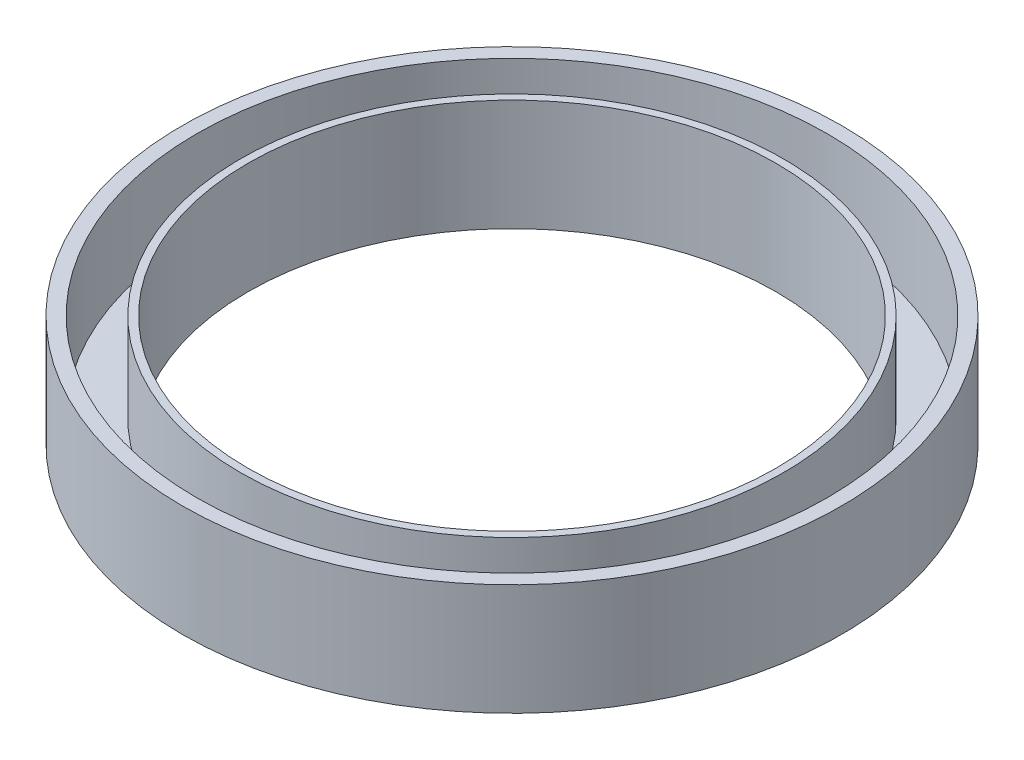
ISO-10303-21;
HEADER;
FILE_DESCRIPTION(('STEP AP214'),'2;1');
FILE_NAME('part.step','',(''),(''),'','','');
FILE_SCHEMA(('AUTOMOTIVE_DESIGN { 1 0 10303 214 1 1 1 1 }'));
ENDSEC;
DATA;
#1=APPLICATION_CONTEXT('core data for automotive mechanical design processes');
#2=APPLICATION_PROTOCOL_DEFINITION('international standard','automotive_design',2000,#1);
#3=PRODUCT_CONTEXT('',#1,'mechanical');
#4=PRODUCT('Part','Part','',(#3));
#5=PRODUCT_RELATED_PRODUCT_CATEGORY('part','',(#4));
#6=PRODUCT_DEFINITION_FORMATION('','',#4);
#7=PRODUCT_DEFINITION_CONTEXT('part definition',#1,'design');
#8=PRODUCT_DEFINITION('design','',#6,#7);
#9=PRODUCT_DEFINITION_SHAPE('','',#8);
#10=(LENGTH_UNIT() NAMED_UNIT(*) SI_UNIT(.MILLI.,.METRE.));
#11=(NAMED_UNIT(*) PLANE_ANGLE_UNIT() SI_UNIT($,.RADIAN.));
#12=(NAMED_UNIT(*) SI_UNIT($,.STERADIAN.) SOLID_ANGLE_UNIT());
#13=UNCERTAINTY_MEASURE_WITH_UNIT(LENGTH_MEASURE(1.E-05),#10,'distance_accuracy_value','');
#14=(GEOMETRIC_REPRESENTATION_CONTEXT(3) GLOBAL_UNCERTAINTY_ASSIGNED_CONTEXT((#13)) GLOBAL_UNIT_ASSIGNED_CONTEXT((#10,
#11,#12)) REPRESENTATION_CONTEXT('',''));
#15=CARTESIAN_POINT('',(0.,0.,0.));
#16=DIRECTION('',(0.,0.,1.));
#17=DIRECTION('',(1.,0.,0.));
#18=AXIS2_PLACEMENT_3D('',#15,#16,#17);
#19=CARTESIAN_POINT('',(0.,2.5,0.));
#20=DIRECTION('',(0.,1.,0.));
#21=DIRECTION('',(0.,0.,1.));
#22=AXIS2_PLACEMENT_3D('',#19,#20,#21);
#23=PLANE('',#22);
#24=CARTESIAN_POINT('',(0.,2.5,0.));
#25=DIRECTION('',(0.,1.,0.));
#26=DIRECTION('',(0.,0.,1.));
#27=AXIS2_PLACEMENT_3D('',#24,#25,#26);
#28=CIRCLE('',#27,30.5);
#29=CARTESIAN_POINT('',(0.,2.5,30.5));
#30=VERTEX_POINT('',#29);
#31=EDGE_CURVE('E66',#30,#30,#28,.T.);
#32=ORIENTED_EDGE('',*,*,#31,.F.);
#33=EDGE_LOOP('',(#32));
#34=FACE_BOUND('',#33,.T.);
#35=CARTESIAN_POINT('',(0.,2.5,0.));
#36=DIRECTION('',(0.,1.,0.));
#37=DIRECTION('',(0.,0.,1.));
#38=AXIS2_PLACEMENT_3D('',#35,#36,#37);
#39=CIRCLE('',#38,35.4);
#40=CARTESIAN_POINT('',(0.,2.5,35.4));
#41=VERTEX_POINT('',#40);
#42=EDGE_CURVE('E11',#41,#41,#39,.F.);
#43=ORIENTED_EDGE('',*,*,#42,.F.);
#44=EDGE_LOOP('',(#43));
#45=FACE_BOUND('',#44,.T.);
#46=ADVANCED_FACE('F42',(#34,#45),#23,.T.);
#47=CARTESIAN_POINT('',(0.,0.,0.));
#48=DIRECTION('',(0.,1.,0.));
#49=DIRECTION('',(0.,0.,1.));
#50=AXIS2_PLACEMENT_3D('',#47,#48,#49);
#51=PLANE('',#50);
#52=CARTESIAN_POINT('',(0.,0.,0.));
#53=DIRECTION('',(0.,1.,0.));
#54=DIRECTION('',(0.,0.,1.));
#55=AXIS2_PLACEMENT_3D('',#52,#53,#54);
#56=CIRCLE('',#55,37.);
#57=CARTESIAN_POINT('',(0.,0.,37.));
#58=VERTEX_POINT('',#57);
#59=EDGE_CURVE('E49',#58,#58,#56,.T.);
#60=ORIENTED_EDGE('',*,*,#59,.F.);
#61=EDGE_LOOP('',(#60));
#62=FACE_BOUND('',#61,.T.);
#63=CARTESIAN_POINT('',(0.,0.,0.));
#64=DIRECTION('',(0.,1.,0.));
#65=DIRECTION('',(0.,0.,1.));
#66=AXIS2_PLACEMENT_3D('',#63,#64,#65);
#67=CIRCLE('',#66,29.65);
#68=CARTESIAN_POINT('',(0.,0.,29.65));
#69=VERTEX_POINT('',#68);
#70=EDGE_CURVE('E53',#69,#69,#67,.T.);
#71=ORIENTED_EDGE('',*,*,#70,.T.);
#72=EDGE_LOOP('',(#71));
#73=FACE_BOUND('',#72,.T.);
#74=ADVANCED_FACE('F90',(#62,#73),#51,.F.);
#75=CARTESIAN_POINT('',(0.,2.5,0.));
#76=DIRECTION('',(0.,-1.,0.));
#77=DIRECTION('',(0.,0.,-1.));
#78=AXIS2_PLACEMENT_3D('',#75,#76,#77);
#79=CYLINDRICAL_SURFACE('',#78,37.);
#80=ORIENTED_EDGE('',*,*,#59,.T.);
#81=EDGE_LOOP('',(#80));
#82=FACE_BOUND('',#81,.T.);
#83=CARTESIAN_POINT('',(0.,12.5,0.));
#84=DIRECTION('',(0.,1.,0.));
#85=DIRECTION('',(0.,0.,1.));
#86=AXIS2_PLACEMENT_3D('',#83,#84,#85);
#87=CIRCLE('',#86,37.);
#88=CARTESIAN_POINT('',(0.,12.5,37.));
#89=VERTEX_POINT('',#88);
#90=EDGE_CURVE('E57',#89,#89,#87,.T.);
#91=ORIENTED_EDGE('',*,*,#90,.F.);
#92=EDGE_LOOP('',(#91));
#93=FACE_BOUND('',#92,.T.);
#94=ADVANCED_FACE('F44',(#82,#93),#79,.T.);
#95=CARTESIAN_POINT('',(0.,2.5,0.));
#96=DIRECTION('',(0.,-1.,0.));
#97=DIRECTION('',(0.,0.,-1.));
#98=AXIS2_PLACEMENT_3D('',#95,#96,#97);
#99=CYLINDRICAL_SURFACE('',#98,29.65);
#100=ORIENTED_EDGE('',*,*,#70,.F.);
#101=EDGE_LOOP('',(#100));
#102=FACE_BOUND('',#101,.T.);
#103=CARTESIAN_POINT('',(0.,12.5,0.));
#104=DIRECTION('',(0.,1.,0.));
#105=DIRECTION('',(0.,0.,1.));
#106=AXIS2_PLACEMENT_3D('',#103,#104,#105);
#107=CIRCLE('',#106,29.65);
#108=CARTESIAN_POINT('',(0.,12.5,29.65));
#109=VERTEX_POINT('',#108);
#110=EDGE_CURVE('E69',#109,#109,#107,.F.);
#111=ORIENTED_EDGE('',*,*,#110,.F.);
#112=EDGE_LOOP('',(#111));
#113=FACE_BOUND('',#112,.T.);
#114=ADVANCED_FACE('F78',(#102,#113),#99,.F.);
#115=CARTESIAN_POINT('',(0.,12.5,0.));
#116=DIRECTION('',(0.,-1.,0.));
#117=DIRECTION('',(0.,0.,-1.));
#118=AXIS2_PLACEMENT_3D('',#115,#116,#117);
#119=CYLINDRICAL_SURFACE('',#118,35.4);
#120=CARTESIAN_POINT('',(0.,12.5,0.));
#121=DIRECTION('',(0.,1.,0.));
#122=DIRECTION('',(0.,0.,1.));
#123=AXIS2_PLACEMENT_3D('',#120,#121,#122);
#124=CIRCLE('',#123,35.4);
#125=CARTESIAN_POINT('',(0.,12.5,35.4));
#126=VERTEX_POINT('',#125);
#127=EDGE_CURVE('E62',#126,#126,#124,.T.);
#128=ORIENTED_EDGE('',*,*,#127,.T.);
#129=EDGE_LOOP('',(#128));
#130=FACE_BOUND('',#129,.T.);
#131=ORIENTED_EDGE('',*,*,#42,.T.);
#132=EDGE_LOOP('',(#131));
#133=FACE_BOUND('',#132,.T.);
#134=ADVANCED_FACE('F80',(#130,#133),#119,.F.);
#135=CARTESIAN_POINT('',(0.,12.5,0.));
#136=DIRECTION('',(0.,1.,0.));
#137=DIRECTION('',(0.,0.,1.));
#138=AXIS2_PLACEMENT_3D('',#135,#136,#137);
#139=PLANE('',#138);
#140=ORIENTED_EDGE('',*,*,#127,.F.);
#141=EDGE_LOOP('',(#140));
#142=FACE_BOUND('',#141,.T.);
#143=ORIENTED_EDGE('',*,*,#90,.T.);
#144=EDGE_LOOP('',(#143));
#145=FACE_BOUND('',#144,.T.);
#146=ADVANCED_FACE('F87',(#142,#145),#139,.T.);
#147=CARTESIAN_POINT('',(0.,12.5,0.));
#148=DIRECTION('',(0.,-1.,0.));
#149=DIRECTION('',(0.,0.,-1.));
#150=AXIS2_PLACEMENT_3D('',#147,#148,#149);
#151=CYLINDRICAL_SURFACE('',#150,30.5);
#152=CARTESIAN_POINT('',(0.,12.5,0.));
#153=DIRECTION('',(0.,1.,0.));
#154=DIRECTION('',(0.,0.,1.));
#155=AXIS2_PLACEMENT_3D('',#152,#153,#154);
#156=CIRCLE('',#155,30.5);
#157=CARTESIAN_POINT('',(0.,12.5,30.5));
#158=VERTEX_POINT('',#157);
#159=EDGE_CURVE('E65',#158,#158,#156,.T.);
#160=ORIENTED_EDGE('',*,*,#159,.F.);
#161=EDGE_LOOP('',(#160));
#162=FACE_BOUND('',#161,.T.);
#163=ORIENTED_EDGE('',*,*,#31,.T.);
#164=EDGE_LOOP('',(#163));
#165=FACE_BOUND('',#164,.T.);
#166=ADVANCED_FACE('F102',(#162,#165),#151,.T.);
#167=CARTESIAN_POINT('',(0.,12.5,0.));
#168=DIRECTION('',(0.,1.,0.));
#169=DIRECTION('',(0.,0.,1.));
#170=AXIS2_PLACEMENT_3D('',#167,#168,#169);
#171=PLANE('',#170);
#172=ORIENTED_EDGE('',*,*,#110,.T.);
#173=EDGE_LOOP('',(#172));
#174=FACE_BOUND('',#173,.T.);
#175=ORIENTED_EDGE('',*,*,#159,.T.);
#176=EDGE_LOOP('',(#175));
#177=FACE_BOUND('',#176,.T.);
#178=ADVANCED_FACE('F75',(#174,#177),#171,.T.);
#179=CLOSED_SHELL('',(#46,#74,#94,#114,#134,#146,#166,#178));
#180=MANIFOLD_SOLID_BREP('B2',#179);
#181=ADVANCED_BREP_SHAPE_REPRESENTATION('',(#18,#180),#14);
#182=SHAPE_DEFINITION_REPRESENTATION(#9,#181);
ENDSEC;
END-ISO-10303-21;
